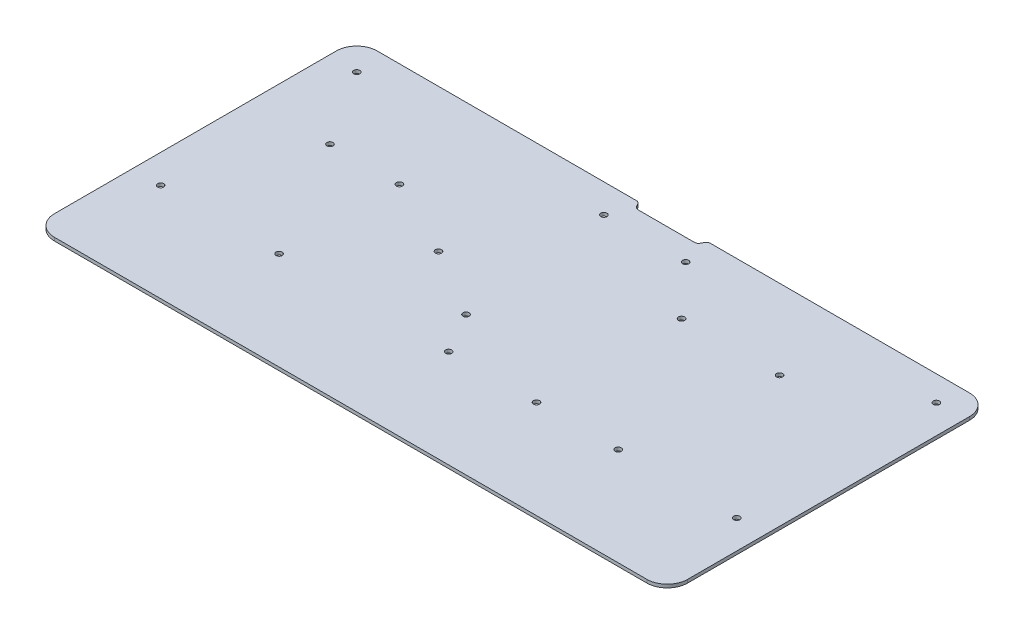
ISO-10303-21;
HEADER;
FILE_DESCRIPTION(('STEP AP214'),'2;1');
FILE_NAME('part.step','',(''),(''),'','','');
FILE_SCHEMA(('AUTOMOTIVE_DESIGN { 1 0 10303 214 1 1 1 1 }'));
ENDSEC;
DATA;
#1=APPLICATION_CONTEXT('core data for automotive mechanical design processes');
#2=APPLICATION_PROTOCOL_DEFINITION('international standard','automotive_design',2000,#1);
#3=PRODUCT_CONTEXT('',#1,'mechanical');
#4=PRODUCT('Part','Part','',(#3));
#5=PRODUCT_RELATED_PRODUCT_CATEGORY('part','',(#4));
#6=PRODUCT_DEFINITION_FORMATION('','',#4);
#7=PRODUCT_DEFINITION_CONTEXT('part definition',#1,'design');
#8=PRODUCT_DEFINITION('design','',#6,#7);
#9=PRODUCT_DEFINITION_SHAPE('','',#8);
#10=(LENGTH_UNIT() NAMED_UNIT(*) SI_UNIT(.MILLI.,.METRE.));
#11=(NAMED_UNIT(*) PLANE_ANGLE_UNIT() SI_UNIT($,.RADIAN.));
#12=(NAMED_UNIT(*) SI_UNIT($,.STERADIAN.) SOLID_ANGLE_UNIT());
#13=UNCERTAINTY_MEASURE_WITH_UNIT(LENGTH_MEASURE(1.E-05),#10,'distance_accuracy_value','');
#14=(GEOMETRIC_REPRESENTATION_CONTEXT(3) GLOBAL_UNCERTAINTY_ASSIGNED_CONTEXT((#13)) GLOBAL_UNIT_ASSIGNED_CONTEXT((#10,
#11,#12)) REPRESENTATION_CONTEXT('',''));
#15=CARTESIAN_POINT('',(0.,0.,0.));
#16=DIRECTION('',(0.,0.,1.));
#17=DIRECTION('',(1.,0.,0.));
#18=AXIS2_PLACEMENT_3D('',#15,#16,#17);
#19=CARTESIAN_POINT('',(10.,1.6,10.));
#20=DIRECTION('',(0.,1.,0.));
#21=DIRECTION('',(0.,0.,1.));
#22=AXIS2_PLACEMENT_3D('',#19,#20,#21);
#23=PLANE('',#22);
#24=CARTESIAN_POINT('',(198.,1.6,110.));
#25=DIRECTION('',(0.,1.,0.));
#26=DIRECTION('',(0.,0.,1.));
#27=AXIS2_PLACEMENT_3D('',#24,#25,#26);
#28=CIRCLE('',#27,1.5);
#29=CARTESIAN_POINT('',(198.,1.6,111.5));
#30=VERTEX_POINT('',#29);
#31=EDGE_CURVE('E444',#30,#30,#28,.T.);
#32=ORIENTED_EDGE('',*,*,#31,.F.);
#33=EDGE_LOOP('',(#32));
#34=FACE_BOUND('',#33,.T.);
#35=CARTESIAN_POINT('',(110.,1.6,69.9999999999988));
#36=DIRECTION('',(0.,1.,0.));
#37=DIRECTION('',(0.,0.,1.));
#38=AXIS2_PLACEMENT_3D('',#35,#36,#37);
#39=CIRCLE('',#38,1.5);
#40=CARTESIAN_POINT('',(110.,1.6,71.4999999999988));
#41=VERTEX_POINT('',#40);
#42=EDGE_CURVE('E460',#41,#41,#39,.T.);
#43=ORIENTED_EDGE('',*,*,#42,.F.);
#44=EDGE_LOOP('',(#43));
#45=FACE_BOUND('',#44,.T.);
#46=CARTESIAN_POINT('',(246.,1.6,39.));
#47=DIRECTION('',(0.,1.,0.));
#48=DIRECTION('',(0.,0.,1.));
#49=AXIS2_PLACEMENT_3D('',#46,#47,#48);
#50=CIRCLE('',#49,1.49999999999997);
#51=CARTESIAN_POINT('',(246.,1.6,40.5));
#52=VERTEX_POINT('',#51);
#53=EDGE_CURVE('E476',#52,#52,#50,.T.);
#54=ORIENTED_EDGE('',*,*,#53,.F.);
#55=EDGE_LOOP('',(#54));
#56=FACE_BOUND('',#55,.T.);
#57=CARTESIAN_POINT('',(72.,1.6,51.0967741935482));
#58=DIRECTION('',(0.,1.,0.));
#59=DIRECTION('',(0.,0.,1.));
#60=AXIS2_PLACEMENT_3D('',#57,#58,#59);
#61=CIRCLE('',#60,1.50000000000001);
#62=CARTESIAN_POINT('',(72.,1.6,52.5967741935482));
#63=VERTEX_POINT('',#62);
#64=EDGE_CURVE('E492',#63,#63,#61,.T.);
#65=ORIENTED_EDGE('',*,*,#64,.F.);
#66=EDGE_LOOP('',(#65));
#67=FACE_BOUND('',#66,.T.);
#68=CARTESIAN_POINT('',(155.,1.6,110.));
#69=DIRECTION('',(0.,1.,0.));
#70=DIRECTION('',(0.,0.,1.));
#71=AXIS2_PLACEMENT_3D('',#68,#69,#70);
#72=CIRCLE('',#71,1.5);
#73=CARTESIAN_POINT('',(155.,1.6,111.5));
#74=VERTEX_POINT('',#73);
#75=EDGE_CURVE('E508',#74,#74,#72,.T.);
#76=ORIENTED_EDGE('',*,*,#75,.F.);
#77=EDGE_LOOP('',(#76));
#78=FACE_BOUND('',#77,.T.);
#79=CARTESIAN_POINT('',(14.,1.6,110.));
#80=DIRECTION('',(0.,1.,0.));
#81=DIRECTION('',(0.,0.,1.));
#82=AXIS2_PLACEMENT_3D('',#79,#80,#81);
#83=CIRCLE('',#82,1.49999999999997);
#84=CARTESIAN_POINT('',(14.,1.6,111.5));
#85=VERTEX_POINT('',#84);
#86=EDGE_CURVE('E524',#85,#85,#83,.T.);
#87=ORIENTED_EDGE('',*,*,#86,.F.);
#88=EDGE_LOOP('',(#87));
#89=FACE_BOUND('',#88,.T.);
#90=CARTESIAN_POINT('',(296.,1.6,12.2856825395512));
#91=DIRECTION('',(0.,1.,0.));
#92=DIRECTION('',(0.,0.,1.));
#93=AXIS2_PLACEMENT_3D('',#90,#91,#92);
#94=CIRCLE('',#93,1.49999999999997);
#95=CARTESIAN_POINT('',(296.,1.6,13.7856825395512));
#96=VERTEX_POINT('',#95);
#97=EDGE_CURVE('E540',#96,#96,#94,.T.);
#98=ORIENTED_EDGE('',*,*,#97,.F.);
#99=EDGE_LOOP('',(#98));
#100=FACE_BOUND('',#99,.T.);
#101=CARTESIAN_POINT('',(296.,1.6,110.));
#102=DIRECTION('',(0.,1.,0.));
#103=DIRECTION('',(0.,0.,1.));
#104=AXIS2_PLACEMENT_3D('',#101,#102,#103);
#105=CIRCLE('',#104,1.49999999999997);
#106=CARTESIAN_POINT('',(296.,1.6,111.5));
#107=VERTEX_POINT('',#106);
#108=EDGE_CURVE('E194',#107,#107,#105,.T.);
#109=ORIENTED_EDGE('',*,*,#108,.F.);
#110=EDGE_LOOP('',(#109));
#111=FACE_BOUND('',#110,.T.);
#112=CARTESIAN_POINT('',(10.,1.6,10.));
#113=DIRECTION('',(0.,1.,0.));
#114=DIRECTION('',(0.,0.,1.));
#115=AXIS2_PLACEMENT_3D('',#112,#113,#114);
#116=CIRCLE('',#115,10.);
#117=CARTESIAN_POINT('',(10.,1.6,0.));
#118=VERTEX_POINT('',#117);
#119=CARTESIAN_POINT('',(0.,1.6,10.));
#120=VERTEX_POINT('',#119);
#121=EDGE_CURVE('E237',#118,#120,#116,.T.);
#122=ORIENTED_EDGE('',*,*,#121,.T.);
#123=DIRECTION('',(0.,0.,1.));
#124=VECTOR('',#123,1.);
#125=CARTESIAN_POINT('',(0.,1.6,148.));
#126=LINE('',#125,#124);
#127=CARTESIAN_POINT('',(0.,1.6,148.));
#128=VERTEX_POINT('',#127);
#129=EDGE_CURVE('E124',#120,#128,#126,.T.);
#130=ORIENTED_EDGE('',*,*,#129,.T.);
#131=CARTESIAN_POINT('',(10.,1.6,148.));
#132=DIRECTION('',(0.,1.,0.));
#133=DIRECTION('',(0.,0.,-1.));
#134=AXIS2_PLACEMENT_3D('',#131,#132,#133);
#135=CIRCLE('',#134,10.);
#136=CARTESIAN_POINT('',(10.0000000000001,1.6,158.));
#137=VERTEX_POINT('',#136);
#138=EDGE_CURVE('E290',#128,#137,#135,.T.);
#139=ORIENTED_EDGE('',*,*,#138,.T.);
#140=DIRECTION('',(1.,0.,0.));
#141=VECTOR('',#140,1.);
#142=CARTESIAN_POINT('',(10.0000000000001,1.6,158.));
#143=LINE('',#142,#141);
#144=CARTESIAN_POINT('',(300.,1.6,158.));
#145=VERTEX_POINT('',#144);
#146=EDGE_CURVE('E310',#137,#145,#143,.T.);
#147=ORIENTED_EDGE('',*,*,#146,.T.);
#148=CARTESIAN_POINT('',(300.,1.6,148.));
#149=DIRECTION('',(0.,1.,0.));
#150=DIRECTION('',(0.,0.,-1.));
#151=AXIS2_PLACEMENT_3D('',#148,#149,#150);
#152=CIRCLE('',#151,10.);
#153=CARTESIAN_POINT('',(310.,1.6,148.));
#154=VERTEX_POINT('',#153);
#155=EDGE_CURVE('E306',#145,#154,#152,.T.);
#156=ORIENTED_EDGE('',*,*,#155,.T.);
#157=DIRECTION('',(0.,0.,-1.));
#158=VECTOR('',#157,1.);
#159=CARTESIAN_POINT('',(310.,1.6,148.));
#160=LINE('',#159,#158);
#161=CARTESIAN_POINT('',(310.,1.6,10.));
#162=VERTEX_POINT('',#161);
#163=EDGE_CURVE('E309',#154,#162,#160,.T.);
#164=ORIENTED_EDGE('',*,*,#163,.T.);
#165=CARTESIAN_POINT('',(300.,1.6,10.));
#166=DIRECTION('',(0.,1.,0.));
#167=DIRECTION('',(0.,0.,-1.));
#168=AXIS2_PLACEMENT_3D('',#165,#166,#167);
#169=CIRCLE('',#168,9.99999999999998);
#170=CARTESIAN_POINT('',(300.,1.6,0.));
#171=VERTEX_POINT('',#170);
#172=EDGE_CURVE('E314',#162,#171,#169,.T.);
#173=ORIENTED_EDGE('',*,*,#172,.T.);
#174=DIRECTION('',(-1.,0.,0.));
#175=VECTOR('',#174,1.);
#176=CARTESIAN_POINT('',(173.115639288473,1.6,0.));
#177=LINE('',#176,#175);
#178=CARTESIAN_POINT('',(173.115639288473,1.6,0.));
#179=VERTEX_POINT('',#178);
#180=EDGE_CURVE('E321',#171,#179,#177,.T.);
#181=ORIENTED_EDGE('',*,*,#180,.T.);
#182=CARTESIAN_POINT('',(173.115639288473,1.6,2.));
#183=DIRECTION('',(0.,1.,0.));
#184=DIRECTION('',(0.,0.,1.));
#185=AXIS2_PLACEMENT_3D('',#182,#183,#184);
#186=CIRCLE('',#185,2.00000000000002);
#187=CARTESIAN_POINT('',(171.365639288473,1.6,1.03175416344812));
#188=VERTEX_POINT('',#187);
#189=EDGE_CURVE('E324',#179,#188,#186,.T.);
#190=ORIENTED_EDGE('',*,*,#189,.T.);
#191=DIRECTION('',(-0.484122918275934,0.,0.874999999999996));
#192=VECTOR('',#191,1.);
#193=CARTESIAN_POINT('',(170.570852384631,1.6,2.46824583655185));
#194=LINE('',#193,#192);
#195=CARTESIAN_POINT('',(170.570852384631,1.6,2.46824583655186));
#196=VERTEX_POINT('',#195);
#197=EDGE_CURVE('E327',#188,#196,#194,.T.);
#198=ORIENTED_EDGE('',*,*,#197,.T.);
#199=CARTESIAN_POINT('',(168.820852384631,1.6,1.5));
#200=DIRECTION('',(0.,-1.,0.));
#201=DIRECTION('',(0.,0.,-1.));
#202=AXIS2_PLACEMENT_3D('',#199,#200,#201);
#203=CIRCLE('',#202,1.99999999999997);
#204=CARTESIAN_POINT('',(168.820852384631,1.6,3.5));
#205=VERTEX_POINT('',#204);
#206=EDGE_CURVE('E330',#196,#205,#203,.T.);
#207=ORIENTED_EDGE('',*,*,#206,.T.);
#208=DIRECTION('',(-1.,0.,0.));
#209=VECTOR('',#208,1.);
#210=CARTESIAN_POINT('',(166.5,1.6,3.5));
#211=LINE('',#210,#209);
#212=CARTESIAN_POINT('',(141.179147615369,1.6,3.5));
#213=VERTEX_POINT('',#212);
#214=EDGE_CURVE('E333',#205,#213,#211,.T.);
#215=ORIENTED_EDGE('',*,*,#214,.T.);
#216=CARTESIAN_POINT('',(141.179147615369,1.6,1.5));
#217=DIRECTION('',(0.,-1.,0.));
#218=DIRECTION('',(0.,0.,-1.));
#219=AXIS2_PLACEMENT_3D('',#216,#217,#218);
#220=CIRCLE('',#219,2.);
#221=CARTESIAN_POINT('',(139.429147615369,1.6,2.46824583655185));
#222=VERTEX_POINT('',#221);
#223=EDGE_CURVE('E167',#213,#222,#220,.T.);
#224=ORIENTED_EDGE('',*,*,#223,.T.);
#225=DIRECTION('',(-0.484122918275929,0.,-0.874999999999999));
#226=VECTOR('',#225,1.);
#227=CARTESIAN_POINT('',(139.429147615369,1.6,2.46824583655185));
#228=LINE('',#227,#226);
#229=CARTESIAN_POINT('',(138.634360711527,1.6,1.03175416344815));
#230=VERTEX_POINT('',#229);
#231=EDGE_CURVE('E161',#222,#230,#228,.T.);
#232=ORIENTED_EDGE('',*,*,#231,.T.);
#233=CARTESIAN_POINT('',(136.884360711527,1.6,2.));
#234=DIRECTION('',(0.,1.,0.));
#235=DIRECTION('',(0.,0.,-1.));
#236=AXIS2_PLACEMENT_3D('',#233,#234,#235);
#237=CIRCLE('',#236,2.);
#238=CARTESIAN_POINT('',(136.884360711527,1.6,0.));
#239=VERTEX_POINT('',#238);
#240=EDGE_CURVE('E165',#230,#239,#237,.T.);
#241=ORIENTED_EDGE('',*,*,#240,.T.);
#242=DIRECTION('',(-1.,0.,0.));
#243=VECTOR('',#242,1.);
#244=CARTESIAN_POINT('',(10.,1.6,0.));
#245=LINE('',#244,#243);
#246=EDGE_CURVE('E57',#239,#118,#245,.T.);
#247=ORIENTED_EDGE('',*,*,#246,.T.);
#248=EDGE_LOOP('',(#122,#130,#139,#147,#156,#164,#173,#181,#190,#198,#207,#215,#224,#232,#241,#247));
#249=FACE_BOUND('',#248,.T.);
#250=CARTESIAN_POINT('',(14.,1.6,14.));
#251=DIRECTION('',(0.,1.,0.));
#252=DIRECTION('',(0.,0.,1.));
#253=AXIS2_PLACEMENT_3D('',#250,#251,#252);
#254=CIRCLE('',#253,1.5);
#255=CARTESIAN_POINT('',(14.,1.6,15.5));
#256=VERTEX_POINT('',#255);
#257=EDGE_CURVE('E548',#256,#256,#254,.T.);
#258=ORIENTED_EDGE('',*,*,#257,.F.);
#259=EDGE_LOOP('',(#258));
#260=FACE_BOUND('',#259,.T.);
#261=CARTESIAN_POINT('',(175.,1.6,14.));
#262=DIRECTION('',(0.,1.,0.));
#263=DIRECTION('',(0.,0.,1.));
#264=AXIS2_PLACEMENT_3D('',#261,#262,#263);
#265=CIRCLE('',#264,1.49999999999997);
#266=CARTESIAN_POINT('',(175.,1.6,15.5));
#267=VERTEX_POINT('',#266);
#268=EDGE_CURVE('E532',#267,#267,#265,.T.);
#269=ORIENTED_EDGE('',*,*,#268,.F.);
#270=EDGE_LOOP('',(#269));
#271=FACE_BOUND('',#270,.T.);
#272=CARTESIAN_POINT('',(135.,1.6,14.));
#273=DIRECTION('',(0.,1.,0.));
#274=DIRECTION('',(0.,0.,1.));
#275=AXIS2_PLACEMENT_3D('',#272,#273,#274);
#276=CIRCLE('',#275,1.49999999999997);
#277=CARTESIAN_POINT('',(135.,1.6,15.5));
#278=VERTEX_POINT('',#277);
#279=EDGE_CURVE('E516',#278,#278,#276,.T.);
#280=ORIENTED_EDGE('',*,*,#279,.F.);
#281=EDGE_LOOP('',(#280));
#282=FACE_BOUND('',#281,.T.);
#283=CARTESIAN_POINT('',(72.,1.6,110.));
#284=DIRECTION('',(0.,1.,0.));
#285=DIRECTION('',(0.,0.,1.));
#286=AXIS2_PLACEMENT_3D('',#283,#284,#285);
#287=CIRCLE('',#286,1.5);
#288=CARTESIAN_POINT('',(72.,1.6,111.5));
#289=VERTEX_POINT('',#288);
#290=EDGE_CURVE('E500',#289,#289,#287,.T.);
#291=ORIENTED_EDGE('',*,*,#290,.F.);
#292=EDGE_LOOP('',(#291));
#293=FACE_BOUND('',#292,.T.);
#294=CARTESIAN_POINT('',(238.,1.6,110.));
#295=DIRECTION('',(0.,1.,0.));
#296=DIRECTION('',(0.,0.,1.));
#297=AXIS2_PLACEMENT_3D('',#294,#295,#296);
#298=CIRCLE('',#297,1.49999999999997);
#299=CARTESIAN_POINT('',(238.,1.6,111.5));
#300=VERTEX_POINT('',#299);
#301=EDGE_CURVE('E484',#300,#300,#298,.T.);
#302=ORIENTED_EDGE('',*,*,#301,.F.);
#303=EDGE_LOOP('',(#302));
#304=FACE_BOUND('',#303,.T.);
#305=CARTESIAN_POINT('',(198.,1.6,39.));
#306=DIRECTION('',(0.,1.,0.));
#307=DIRECTION('',(0.,0.,1.));
#308=AXIS2_PLACEMENT_3D('',#305,#306,#307);
#309=CIRCLE('',#308,1.5);
#310=CARTESIAN_POINT('',(198.,1.6,40.5));
#311=VERTEX_POINT('',#310);
#312=EDGE_CURVE('E468',#311,#311,#309,.T.);
#313=ORIENTED_EDGE('',*,*,#312,.F.);
#314=EDGE_LOOP('',(#313));
#315=FACE_BOUND('',#314,.T.);
#316=CARTESIAN_POINT('',(38.,1.6,51.0967741935482));
#317=DIRECTION('',(0.,1.,0.));
#318=DIRECTION('',(0.,0.,1.));
#319=AXIS2_PLACEMENT_3D('',#316,#317,#318);
#320=CIRCLE('',#319,1.5);
#321=CARTESIAN_POINT('',(38.,1.6,52.5967741935482));
#322=VERTEX_POINT('',#321);
#323=EDGE_CURVE('E452',#322,#322,#320,.T.);
#324=ORIENTED_EDGE('',*,*,#323,.F.);
#325=EDGE_LOOP('',(#324));
#326=FACE_BOUND('',#325,.T.);
#327=CARTESIAN_POINT('',(143.5,1.6,89.9999999999986));
#328=DIRECTION('',(0.,1.,0.));
#329=DIRECTION('',(0.,0.,1.));
#330=AXIS2_PLACEMENT_3D('',#327,#328,#329);
#331=CIRCLE('',#330,1.5);
#332=CARTESIAN_POINT('',(143.5,1.6,91.4999999999986));
#333=VERTEX_POINT('',#332);
#334=EDGE_CURVE('E433',#333,#333,#331,.T.);
#335=ORIENTED_EDGE('',*,*,#334,.F.);
#336=EDGE_LOOP('',(#335));
#337=FACE_BOUND('',#336,.T.);
#338=ADVANCED_FACE('F39',(#34,#45,#56,#67,#78,#89,#100,#111,#249,#260,#271,#282,#293,#304,#315,
#326,#337),#23,.T.);
#339=CARTESIAN_POINT('',(10.,0.,10.));
#340=DIRECTION('',(0.,1.,0.));
#341=DIRECTION('',(0.,0.,1.));
#342=AXIS2_PLACEMENT_3D('',#339,#340,#341);
#343=PLANE('',#342);
#344=CARTESIAN_POINT('',(10.,0.,10.));
#345=DIRECTION('',(0.,1.,0.));
#346=DIRECTION('',(0.,0.,1.));
#347=AXIS2_PLACEMENT_3D('',#344,#345,#346);
#348=CIRCLE('',#347,10.);
#349=CARTESIAN_POINT('',(10.,0.,0.));
#350=VERTEX_POINT('',#349);
#351=CARTESIAN_POINT('',(0.,0.,10.));
#352=VERTEX_POINT('',#351);
#353=EDGE_CURVE('E189',#350,#352,#348,.T.);
#354=ORIENTED_EDGE('',*,*,#353,.F.);
#355=DIRECTION('',(-1.,0.,0.));
#356=VECTOR('',#355,1.);
#357=CARTESIAN_POINT('',(10.,0.,0.));
#358=LINE('',#357,#356);
#359=CARTESIAN_POINT('',(136.884360711527,0.,0.));
#360=VERTEX_POINT('',#359);
#361=EDGE_CURVE('E116',#360,#350,#358,.T.);
#362=ORIENTED_EDGE('',*,*,#361,.F.);
#363=CARTESIAN_POINT('',(136.884360711527,0.,2.));
#364=DIRECTION('',(0.,1.,0.));
#365=DIRECTION('',(0.,0.,-1.));
#366=AXIS2_PLACEMENT_3D('',#363,#364,#365);
#367=CIRCLE('',#366,2.);
#368=CARTESIAN_POINT('',(138.634360711527,0.,1.03175416344815));
#369=VERTEX_POINT('',#368);
#370=EDGE_CURVE('E110',#369,#360,#367,.T.);
#371=ORIENTED_EDGE('',*,*,#370,.F.);
#372=DIRECTION('',(-0.484122918275929,0.,-0.874999999999999));
#373=VECTOR('',#372,1.);
#374=CARTESIAN_POINT('',(139.429147615369,0.,2.46824583655185));
#375=LINE('',#374,#373);
#376=CARTESIAN_POINT('',(139.429147615369,0.,2.46824583655185));
#377=VERTEX_POINT('',#376);
#378=EDGE_CURVE('E176',#377,#369,#375,.T.);
#379=ORIENTED_EDGE('',*,*,#378,.F.);
#380=CARTESIAN_POINT('',(141.179147615369,0.,1.5));
#381=DIRECTION('',(0.,-1.,0.));
#382=DIRECTION('',(0.,0.,-1.));
#383=AXIS2_PLACEMENT_3D('',#380,#381,#382);
#384=CIRCLE('',#383,2.);
#385=CARTESIAN_POINT('',(141.179147615369,0.,3.5));
#386=VERTEX_POINT('',#385);
#387=EDGE_CURVE('E228',#386,#377,#384,.T.);
#388=ORIENTED_EDGE('',*,*,#387,.F.);
#389=DIRECTION('',(-1.,0.,0.));
#390=VECTOR('',#389,1.);
#391=CARTESIAN_POINT('',(141.179147615369,0.,3.5));
#392=LINE('',#391,#390);
#393=CARTESIAN_POINT('',(168.820852384631,0.,3.5));
#394=VERTEX_POINT('',#393);
#395=EDGE_CURVE('E225',#394,#386,#392,.T.);
#396=ORIENTED_EDGE('',*,*,#395,.F.);
#397=CARTESIAN_POINT('',(168.820852384631,0.,1.5));
#398=DIRECTION('',(0.,-1.,0.));
#399=DIRECTION('',(0.,0.,-1.));
#400=AXIS2_PLACEMENT_3D('',#397,#398,#399);
#401=CIRCLE('',#400,1.99999999999997);
#402=CARTESIAN_POINT('',(170.570852384631,0.,2.46824583655186));
#403=VERTEX_POINT('',#402);
#404=EDGE_CURVE('E221',#403,#394,#401,.T.);
#405=ORIENTED_EDGE('',*,*,#404,.F.);
#406=DIRECTION('',(-0.484122918275934,0.,0.874999999999996));
#407=VECTOR('',#406,1.);
#408=CARTESIAN_POINT('',(170.570852384631,0.,2.46824583655185));
#409=LINE('',#408,#407);
#410=CARTESIAN_POINT('',(171.365639288473,0.,1.03175416344812));
#411=VERTEX_POINT('',#410);
#412=EDGE_CURVE('E218',#411,#403,#409,.T.);
#413=ORIENTED_EDGE('',*,*,#412,.F.);
#414=CARTESIAN_POINT('',(173.115639288473,0.,2.));
#415=DIRECTION('',(0.,1.,0.));
#416=DIRECTION('',(0.,0.,1.));
#417=AXIS2_PLACEMENT_3D('',#414,#415,#416);
#418=CIRCLE('',#417,2.00000000000002);
#419=CARTESIAN_POINT('',(173.115639288473,0.,0.));
#420=VERTEX_POINT('',#419);
#421=EDGE_CURVE('E215',#420,#411,#418,.T.);
#422=ORIENTED_EDGE('',*,*,#421,.F.);
#423=DIRECTION('',(-1.,0.,0.));
#424=VECTOR('',#423,1.);
#425=CARTESIAN_POINT('',(173.115639288473,0.,0.));
#426=LINE('',#425,#424);
#427=CARTESIAN_POINT('',(300.,0.,0.));
#428=VERTEX_POINT('',#427);
#429=EDGE_CURVE('E212',#428,#420,#426,.T.);
#430=ORIENTED_EDGE('',*,*,#429,.F.);
#431=CARTESIAN_POINT('',(300.,0.,10.));
#432=DIRECTION('',(0.,1.,0.));
#433=DIRECTION('',(0.,0.,-1.));
#434=AXIS2_PLACEMENT_3D('',#431,#432,#433);
#435=CIRCLE('',#434,9.99999999999998);
#436=CARTESIAN_POINT('',(310.,0.,10.));
#437=VERTEX_POINT('',#436);
#438=EDGE_CURVE('E209',#437,#428,#435,.T.);
#439=ORIENTED_EDGE('',*,*,#438,.F.);
#440=DIRECTION('',(0.,0.,-1.));
#441=VECTOR('',#440,1.);
#442=CARTESIAN_POINT('',(310.,0.,148.));
#443=LINE('',#442,#441);
#444=CARTESIAN_POINT('',(310.,0.,148.));
#445=VERTEX_POINT('',#444);
#446=EDGE_CURVE('E206',#445,#437,#443,.T.);
#447=ORIENTED_EDGE('',*,*,#446,.F.);
#448=CARTESIAN_POINT('',(300.,0.,148.));
#449=DIRECTION('',(0.,1.,0.));
#450=DIRECTION('',(0.,0.,-1.));
#451=AXIS2_PLACEMENT_3D('',#448,#449,#450);
#452=CIRCLE('',#451,10.);
#453=CARTESIAN_POINT('',(300.,0.,158.));
#454=VERTEX_POINT('',#453);
#455=EDGE_CURVE('E203',#454,#445,#452,.T.);
#456=ORIENTED_EDGE('',*,*,#455,.F.);
#457=DIRECTION('',(1.,0.,0.));
#458=VECTOR('',#457,1.);
#459=CARTESIAN_POINT('',(10.0000000000001,0.,158.));
#460=LINE('',#459,#458);
#461=CARTESIAN_POINT('',(10.0000000000001,0.,158.));
#462=VERTEX_POINT('',#461);
#463=EDGE_CURVE('E200',#462,#454,#460,.T.);
#464=ORIENTED_EDGE('',*,*,#463,.F.);
#465=CARTESIAN_POINT('',(10.,0.,148.));
#466=DIRECTION('',(0.,1.,0.));
#467=DIRECTION('',(0.,0.,-1.));
#468=AXIS2_PLACEMENT_3D('',#465,#466,#467);
#469=CIRCLE('',#468,10.);
#470=CARTESIAN_POINT('',(0.,0.,148.));
#471=VERTEX_POINT('',#470);
#472=EDGE_CURVE('E197',#471,#462,#469,.T.);
#473=ORIENTED_EDGE('',*,*,#472,.F.);
#474=DIRECTION('',(0.,0.,1.));
#475=VECTOR('',#474,1.);
#476=CARTESIAN_POINT('',(0.,0.,148.));
#477=LINE('',#476,#475);
#478=EDGE_CURVE('E193',#352,#471,#477,.T.);
#479=ORIENTED_EDGE('',*,*,#478,.F.);
#480=EDGE_LOOP('',(#354,#362,#371,#379,#388,#396,#405,#413,#422,#430,#439,#447,#456,#464,#473,#479));
#481=FACE_BOUND('',#480,.T.);
#482=CARTESIAN_POINT('',(296.,0.,110.));
#483=DIRECTION('',(0.,1.,0.));
#484=DIRECTION('',(0.,0.,1.));
#485=AXIS2_PLACEMENT_3D('',#482,#483,#484);
#486=CIRCLE('',#485,1.49999999999997);
#487=CARTESIAN_POINT('',(296.,0.,111.5));
#488=VERTEX_POINT('',#487);
#489=EDGE_CURVE('E552',#488,#488,#486,.T.);
#490=ORIENTED_EDGE('',*,*,#489,.T.);
#491=EDGE_LOOP('',(#490));
#492=FACE_BOUND('',#491,.T.);
#493=CARTESIAN_POINT('',(14.,0.,14.));
#494=DIRECTION('',(0.,1.,0.));
#495=DIRECTION('',(0.,0.,1.));
#496=AXIS2_PLACEMENT_3D('',#493,#494,#495);
#497=CIRCLE('',#496,1.5);
#498=CARTESIAN_POINT('',(14.,0.,15.5));
#499=VERTEX_POINT('',#498);
#500=EDGE_CURVE('E544',#499,#499,#497,.T.);
#501=ORIENTED_EDGE('',*,*,#500,.T.);
#502=EDGE_LOOP('',(#501));
#503=FACE_BOUND('',#502,.T.);
#504=CARTESIAN_POINT('',(296.,0.,12.2856825395512));
#505=DIRECTION('',(0.,1.,0.));
#506=DIRECTION('',(0.,0.,1.));
#507=AXIS2_PLACEMENT_3D('',#504,#505,#506);
#508=CIRCLE('',#507,1.49999999999997);
#509=CARTESIAN_POINT('',(296.,0.,13.7856825395512));
#510=VERTEX_POINT('',#509);
#511=EDGE_CURVE('E536',#510,#510,#508,.T.);
#512=ORIENTED_EDGE('',*,*,#511,.T.);
#513=EDGE_LOOP('',(#512));
#514=FACE_BOUND('',#513,.T.);
#515=CARTESIAN_POINT('',(175.,0.,14.));
#516=DIRECTION('',(0.,1.,0.));
#517=DIRECTION('',(0.,0.,1.));
#518=AXIS2_PLACEMENT_3D('',#515,#516,#517);
#519=CIRCLE('',#518,1.49999999999997);
#520=CARTESIAN_POINT('',(175.,0.,15.5));
#521=VERTEX_POINT('',#520);
#522=EDGE_CURVE('E528',#521,#521,#519,.T.);
#523=ORIENTED_EDGE('',*,*,#522,.T.);
#524=EDGE_LOOP('',(#523));
#525=FACE_BOUND('',#524,.T.);
#526=CARTESIAN_POINT('',(14.,0.,110.));
#527=DIRECTION('',(0.,1.,0.));
#528=DIRECTION('',(0.,0.,1.));
#529=AXIS2_PLACEMENT_3D('',#526,#527,#528);
#530=CIRCLE('',#529,1.49999999999997);
#531=CARTESIAN_POINT('',(14.,0.,111.5));
#532=VERTEX_POINT('',#531);
#533=EDGE_CURVE('E520',#532,#532,#530,.T.);
#534=ORIENTED_EDGE('',*,*,#533,.T.);
#535=EDGE_LOOP('',(#534));
#536=FACE_BOUND('',#535,.T.);
#537=CARTESIAN_POINT('',(135.,0.,14.));
#538=DIRECTION('',(0.,1.,0.));
#539=DIRECTION('',(0.,0.,1.));
#540=AXIS2_PLACEMENT_3D('',#537,#538,#539);
#541=CIRCLE('',#540,1.49999999999997);
#542=CARTESIAN_POINT('',(135.,0.,15.5));
#543=VERTEX_POINT('',#542);
#544=EDGE_CURVE('E512',#543,#543,#541,.T.);
#545=ORIENTED_EDGE('',*,*,#544,.T.);
#546=EDGE_LOOP('',(#545));
#547=FACE_BOUND('',#546,.T.);
#548=CARTESIAN_POINT('',(155.,0.,110.));
#549=DIRECTION('',(0.,1.,0.));
#550=DIRECTION('',(0.,0.,1.));
#551=AXIS2_PLACEMENT_3D('',#548,#549,#550);
#552=CIRCLE('',#551,1.5);
#553=CARTESIAN_POINT('',(155.,0.,111.5));
#554=VERTEX_POINT('',#553);
#555=EDGE_CURVE('E504',#554,#554,#552,.T.);
#556=ORIENTED_EDGE('',*,*,#555,.T.);
#557=EDGE_LOOP('',(#556));
#558=FACE_BOUND('',#557,.T.);
#559=CARTESIAN_POINT('',(72.,0.,110.));
#560=DIRECTION('',(0.,1.,0.));
#561=DIRECTION('',(0.,0.,1.));
#562=AXIS2_PLACEMENT_3D('',#559,#560,#561);
#563=CIRCLE('',#562,1.5);
#564=CARTESIAN_POINT('',(72.,0.,111.5));
#565=VERTEX_POINT('',#564);
#566=EDGE_CURVE('E496',#565,#565,#563,.T.);
#567=ORIENTED_EDGE('',*,*,#566,.T.);
#568=EDGE_LOOP('',(#567));
#569=FACE_BOUND('',#568,.T.);
#570=CARTESIAN_POINT('',(72.,0.,51.0967741935482));
#571=DIRECTION('',(0.,1.,0.));
#572=DIRECTION('',(0.,0.,1.));
#573=AXIS2_PLACEMENT_3D('',#570,#571,#572);
#574=CIRCLE('',#573,1.50000000000001);
#575=CARTESIAN_POINT('',(72.,0.,52.5967741935482));
#576=VERTEX_POINT('',#575);
#577=EDGE_CURVE('E488',#576,#576,#574,.T.);
#578=ORIENTED_EDGE('',*,*,#577,.T.);
#579=EDGE_LOOP('',(#578));
#580=FACE_BOUND('',#579,.T.);
#581=CARTESIAN_POINT('',(238.,0.,110.));
#582=DIRECTION('',(0.,1.,0.));
#583=DIRECTION('',(0.,0.,1.));
#584=AXIS2_PLACEMENT_3D('',#581,#582,#583);
#585=CIRCLE('',#584,1.49999999999997);
#586=CARTESIAN_POINT('',(238.,0.,111.5));
#587=VERTEX_POINT('',#586);
#588=EDGE_CURVE('E480',#587,#587,#585,.T.);
#589=ORIENTED_EDGE('',*,*,#588,.T.);
#590=EDGE_LOOP('',(#589));
#591=FACE_BOUND('',#590,.T.);
#592=CARTESIAN_POINT('',(246.,0.,39.));
#593=DIRECTION('',(0.,1.,0.));
#594=DIRECTION('',(0.,0.,1.));
#595=AXIS2_PLACEMENT_3D('',#592,#593,#594);
#596=CIRCLE('',#595,1.49999999999997);
#597=CARTESIAN_POINT('',(246.,0.,40.5));
#598=VERTEX_POINT('',#597);
#599=EDGE_CURVE('E472',#598,#598,#596,.T.);
#600=ORIENTED_EDGE('',*,*,#599,.T.);
#601=EDGE_LOOP('',(#600));
#602=FACE_BOUND('',#601,.T.);
#603=CARTESIAN_POINT('',(198.,0.,39.));
#604=DIRECTION('',(0.,1.,0.));
#605=DIRECTION('',(0.,0.,1.));
#606=AXIS2_PLACEMENT_3D('',#603,#604,#605);
#607=CIRCLE('',#606,1.5);
#608=CARTESIAN_POINT('',(198.,0.,40.5));
#609=VERTEX_POINT('',#608);
#610=EDGE_CURVE('E464',#609,#609,#607,.T.);
#611=ORIENTED_EDGE('',*,*,#610,.T.);
#612=EDGE_LOOP('',(#611));
#613=FACE_BOUND('',#612,.T.);
#614=CARTESIAN_POINT('',(110.,0.,69.9999999999988));
#615=DIRECTION('',(0.,1.,0.));
#616=DIRECTION('',(0.,0.,1.));
#617=AXIS2_PLACEMENT_3D('',#614,#615,#616);
#618=CIRCLE('',#617,1.5);
#619=CARTESIAN_POINT('',(110.,0.,71.4999999999988));
#620=VERTEX_POINT('',#619);
#621=EDGE_CURVE('E456',#620,#620,#618,.T.);
#622=ORIENTED_EDGE('',*,*,#621,.T.);
#623=EDGE_LOOP('',(#622));
#624=FACE_BOUND('',#623,.T.);
#625=CARTESIAN_POINT('',(38.,0.,51.0967741935482));
#626=DIRECTION('',(0.,1.,0.));
#627=DIRECTION('',(0.,0.,1.));
#628=AXIS2_PLACEMENT_3D('',#625,#626,#627);
#629=CIRCLE('',#628,1.5);
#630=CARTESIAN_POINT('',(38.,0.,52.5967741935482));
#631=VERTEX_POINT('',#630);
#632=EDGE_CURVE('E448',#631,#631,#629,.T.);
#633=ORIENTED_EDGE('',*,*,#632,.T.);
#634=EDGE_LOOP('',(#633));
#635=FACE_BOUND('',#634,.T.);
#636=CARTESIAN_POINT('',(198.,0.,110.));
#637=DIRECTION('',(0.,1.,0.));
#638=DIRECTION('',(0.,0.,1.));
#639=AXIS2_PLACEMENT_3D('',#636,#637,#638);
#640=CIRCLE('',#639,1.5);
#641=CARTESIAN_POINT('',(198.,0.,111.5));
#642=VERTEX_POINT('',#641);
#643=EDGE_CURVE('E441',#642,#642,#640,.T.);
#644=ORIENTED_EDGE('',*,*,#643,.T.);
#645=EDGE_LOOP('',(#644));
#646=FACE_BOUND('',#645,.T.);
#647=CARTESIAN_POINT('',(143.5,0.,89.9999999999986));
#648=DIRECTION('',(0.,1.,0.));
#649=DIRECTION('',(0.,0.,1.));
#650=AXIS2_PLACEMENT_3D('',#647,#648,#649);
#651=CIRCLE('',#650,1.5);
#652=CARTESIAN_POINT('',(143.5,0.,91.4999999999986));
#653=VERTEX_POINT('',#652);
#654=EDGE_CURVE('E436',#653,#653,#651,.T.);
#655=ORIENTED_EDGE('',*,*,#654,.T.);
#656=EDGE_LOOP('',(#655));
#657=FACE_BOUND('',#656,.T.);
#658=ADVANCED_FACE('F294',(#481,#492,#503,#514,#525,#536,#547,#558,#569,#580,#591,#602,#613,
#624,#635,#646,#657),#343,.F.);
#659=CARTESIAN_POINT('',(10.,1.6,10.));
#660=DIRECTION('',(0.,-1.,0.));
#661=DIRECTION('',(0.,0.,-1.));
#662=AXIS2_PLACEMENT_3D('',#659,#660,#661);
#663=CYLINDRICAL_SURFACE('',#662,10.);
#664=ORIENTED_EDGE('',*,*,#353,.T.);
#665=DIRECTION('',(0.,-1.,0.));
#666=VECTOR('',#665,1.);
#667=CARTESIAN_POINT('',(0.,1.6,10.));
#668=LINE('',#667,#666);
#669=EDGE_CURVE('E11',#120,#352,#668,.T.);
#670=ORIENTED_EDGE('',*,*,#669,.F.);
#671=ORIENTED_EDGE('',*,*,#121,.F.);
#672=DIRECTION('',(0.,-1.,0.));
#673=VECTOR('',#672,1.);
#674=CARTESIAN_POINT('',(10.,1.6,0.));
#675=LINE('',#674,#673);
#676=EDGE_CURVE('E185',#118,#350,#675,.T.);
#677=ORIENTED_EDGE('',*,*,#676,.T.);
#678=EDGE_LOOP('',(#664,#670,#671,#677));
#679=FACE_BOUND('',#678,.T.);
#680=ADVANCED_FACE('F41',(#679),#663,.T.);
#681=CARTESIAN_POINT('',(0.,1.6,148.));
#682=DIRECTION('',(1.,0.,0.));
#683=DIRECTION('',(0.,0.,-1.));
#684=AXIS2_PLACEMENT_3D('',#681,#682,#683);
#685=PLANE('',#684);
#686=ORIENTED_EDGE('',*,*,#478,.T.);
#687=DIRECTION('',(0.,-1.,0.));
#688=VECTOR('',#687,1.);
#689=CARTESIAN_POINT('',(0.,1.6,148.));
#690=LINE('',#689,#688);
#691=EDGE_CURVE('E49',#128,#471,#690,.T.);
#692=ORIENTED_EDGE('',*,*,#691,.F.);
#693=ORIENTED_EDGE('',*,*,#129,.F.);
#694=ORIENTED_EDGE('',*,*,#669,.T.);
#695=EDGE_LOOP('',(#686,#692,#693,#694));
#696=FACE_BOUND('',#695,.T.);
#697=ADVANCED_FACE('F818',(#696),#685,.F.);
#698=CARTESIAN_POINT('',(10.,1.6,148.));
#699=DIRECTION('',(0.,-1.,0.));
#700=DIRECTION('',(0.,0.,-1.));
#701=AXIS2_PLACEMENT_3D('',#698,#699,#700);
#702=CYLINDRICAL_SURFACE('',#701,10.);
#703=ORIENTED_EDGE('',*,*,#472,.T.);
#704=DIRECTION('',(0.,-1.,0.));
#705=VECTOR('',#704,1.);
#706=CARTESIAN_POINT('',(10.0000000000001,1.6,158.));
#707=LINE('',#706,#705);
#708=EDGE_CURVE('E280',#137,#462,#707,.T.);
#709=ORIENTED_EDGE('',*,*,#708,.F.);
#710=ORIENTED_EDGE('',*,*,#138,.F.);
#711=ORIENTED_EDGE('',*,*,#691,.T.);
#712=EDGE_LOOP('',(#703,#709,#710,#711));
#713=FACE_BOUND('',#712,.T.);
#714=ADVANCED_FACE('F288',(#713),#702,.T.);
#715=CARTESIAN_POINT('',(10.0000000000001,1.6,158.));
#716=DIRECTION('',(0.,0.,-1.));
#717=DIRECTION('',(-1.,0.,0.));
#718=AXIS2_PLACEMENT_3D('',#715,#716,#717);
#719=PLANE('',#718);
#720=ORIENTED_EDGE('',*,*,#463,.T.);
#721=DIRECTION('',(0.,-1.,0.));
#722=VECTOR('',#721,1.);
#723=CARTESIAN_POINT('',(300.,1.6,158.));
#724=LINE('',#723,#722);
#725=EDGE_CURVE('E276',#145,#454,#724,.T.);
#726=ORIENTED_EDGE('',*,*,#725,.F.);
#727=ORIENTED_EDGE('',*,*,#146,.F.);
#728=ORIENTED_EDGE('',*,*,#708,.T.);
#729=EDGE_LOOP('',(#720,#726,#727,#728));
#730=FACE_BOUND('',#729,.T.);
#731=ADVANCED_FACE('F300',(#730),#719,.F.);
#732=CARTESIAN_POINT('',(300.,1.6,148.));
#733=DIRECTION('',(0.,-1.,0.));
#734=DIRECTION('',(0.,0.,-1.));
#735=AXIS2_PLACEMENT_3D('',#732,#733,#734);
#736=CYLINDRICAL_SURFACE('',#735,10.);
#737=ORIENTED_EDGE('',*,*,#455,.T.);
#738=DIRECTION('',(0.,-1.,0.));
#739=VECTOR('',#738,1.);
#740=CARTESIAN_POINT('',(310.,1.6,148.));
#741=LINE('',#740,#739);
#742=EDGE_CURVE('E272',#154,#445,#741,.T.);
#743=ORIENTED_EDGE('',*,*,#742,.F.);
#744=ORIENTED_EDGE('',*,*,#155,.F.);
#745=ORIENTED_EDGE('',*,*,#725,.T.);
#746=EDGE_LOOP('',(#737,#743,#744,#745));
#747=FACE_BOUND('',#746,.T.);
#748=ADVANCED_FACE('F304',(#747),#736,.T.);
#749=CARTESIAN_POINT('',(310.,1.6,148.));
#750=DIRECTION('',(-1.,0.,0.));
#751=DIRECTION('',(0.,0.,1.));
#752=AXIS2_PLACEMENT_3D('',#749,#750,#751);
#753=PLANE('',#752);
#754=ORIENTED_EDGE('',*,*,#446,.T.);
#755=DIRECTION('',(0.,-1.,0.));
#756=VECTOR('',#755,1.);
#757=CARTESIAN_POINT('',(310.,1.6,10.));
#758=LINE('',#757,#756);
#759=EDGE_CURVE('E268',#162,#437,#758,.T.);
#760=ORIENTED_EDGE('',*,*,#759,.F.);
#761=ORIENTED_EDGE('',*,*,#163,.F.);
#762=ORIENTED_EDGE('',*,*,#742,.T.);
#763=EDGE_LOOP('',(#754,#760,#761,#762));
#764=FACE_BOUND('',#763,.T.);
#765=ADVANCED_FACE('F783',(#764),#753,.F.);
#766=CARTESIAN_POINT('',(300.,1.6,10.));
#767=DIRECTION('',(0.,-1.,0.));
#768=DIRECTION('',(0.,0.,-1.));
#769=AXIS2_PLACEMENT_3D('',#766,#767,#768);
#770=CYLINDRICAL_SURFACE('',#769,9.99999999999998);
#771=ORIENTED_EDGE('',*,*,#438,.T.);
#772=DIRECTION('',(0.,-1.,0.));
#773=VECTOR('',#772,1.);
#774=CARTESIAN_POINT('',(300.,1.6,0.));
#775=LINE('',#774,#773);
#776=EDGE_CURVE('E264',#171,#428,#775,.T.);
#777=ORIENTED_EDGE('',*,*,#776,.F.);
#778=ORIENTED_EDGE('',*,*,#172,.F.);
#779=ORIENTED_EDGE('',*,*,#759,.T.);
#780=EDGE_LOOP('',(#771,#777,#778,#779));
#781=FACE_BOUND('',#780,.T.);
#782=ADVANCED_FACE('F773',(#781),#770,.T.);
#783=CARTESIAN_POINT('',(173.115639288473,1.6,0.));
#784=DIRECTION('',(0.,0.,1.));
#785=DIRECTION('',(1.,0.,0.));
#786=AXIS2_PLACEMENT_3D('',#783,#784,#785);
#787=PLANE('',#786);
#788=ORIENTED_EDGE('',*,*,#429,.T.);
#789=DIRECTION('',(0.,-1.,0.));
#790=VECTOR('',#789,1.);
#791=CARTESIAN_POINT('',(173.115639288473,1.6,0.));
#792=LINE('',#791,#790);
#793=EDGE_CURVE('E260',#179,#420,#792,.T.);
#794=ORIENTED_EDGE('',*,*,#793,.F.);
#795=ORIENTED_EDGE('',*,*,#180,.F.);
#796=ORIENTED_EDGE('',*,*,#776,.T.);
#797=EDGE_LOOP('',(#788,#794,#795,#796));
#798=FACE_BOUND('',#797,.T.);
#799=ADVANCED_FACE('F763',(#798),#787,.F.);
#800=CARTESIAN_POINT('',(173.115639288473,1.6,2.));
#801=DIRECTION('',(0.,-1.,0.));
#802=DIRECTION('',(0.,0.,-1.));
#803=AXIS2_PLACEMENT_3D('',#800,#801,#802);
#804=CYLINDRICAL_SURFACE('',#803,2.00000000000002);
#805=ORIENTED_EDGE('',*,*,#421,.T.);
#806=DIRECTION('',(0.,-1.,0.));
#807=VECTOR('',#806,1.);
#808=CARTESIAN_POINT('',(171.365639288473,1.6,1.03175416344812));
#809=LINE('',#808,#807);
#810=EDGE_CURVE('E256',#188,#411,#809,.T.);
#811=ORIENTED_EDGE('',*,*,#810,.F.);
#812=ORIENTED_EDGE('',*,*,#189,.F.);
#813=ORIENTED_EDGE('',*,*,#793,.T.);
#814=EDGE_LOOP('',(#805,#811,#812,#813));
#815=FACE_BOUND('',#814,.T.);
#816=ADVANCED_FACE('F753',(#815),#804,.T.);
#817=CARTESIAN_POINT('',(170.570852384631,1.6,2.46824583655185));
#818=DIRECTION('',(0.874999999999996,0.,0.484122918275934));
#819=DIRECTION('',(0.484122918275934,0.,-0.874999999999996));
#820=AXIS2_PLACEMENT_3D('',#817,#818,#819);
#821=PLANE('',#820);
#822=ORIENTED_EDGE('',*,*,#412,.T.);
#823=DIRECTION('',(0.,-1.,0.));
#824=VECTOR('',#823,1.);
#825=CARTESIAN_POINT('',(170.570852384631,1.6,2.46824583655186));
#826=LINE('',#825,#824);
#827=EDGE_CURVE('E252',#196,#403,#826,.T.);
#828=ORIENTED_EDGE('',*,*,#827,.F.);
#829=ORIENTED_EDGE('',*,*,#197,.F.);
#830=ORIENTED_EDGE('',*,*,#810,.T.);
#831=EDGE_LOOP('',(#822,#828,#829,#830));
#832=FACE_BOUND('',#831,.T.);
#833=ADVANCED_FACE('F742',(#832),#821,.F.);
#834=CARTESIAN_POINT('',(168.820852384631,1.6,1.5));
#835=DIRECTION('',(0.,-1.,0.));
#836=DIRECTION('',(0.,0.,-1.));
#837=AXIS2_PLACEMENT_3D('',#834,#835,#836);
#838=CYLINDRICAL_SURFACE('',#837,1.99999999999997);
#839=ORIENTED_EDGE('',*,*,#404,.T.);
#840=DIRECTION('',(0.,-1.,0.));
#841=VECTOR('',#840,1.);
#842=CARTESIAN_POINT('',(168.820852384631,1.6,3.5));
#843=LINE('',#842,#841);
#844=EDGE_CURVE('E248',#205,#394,#843,.T.);
#845=ORIENTED_EDGE('',*,*,#844,.F.);
#846=ORIENTED_EDGE('',*,*,#206,.F.);
#847=ORIENTED_EDGE('',*,*,#827,.T.);
#848=EDGE_LOOP('',(#839,#845,#846,#847));
#849=FACE_BOUND('',#848,.T.);
#850=ADVANCED_FACE('F732',(#849),#838,.F.);
#851=CARTESIAN_POINT('',(141.179147615369,1.6,3.5));
#852=DIRECTION('',(0.,0.,1.));
#853=DIRECTION('',(1.,0.,0.));
#854=AXIS2_PLACEMENT_3D('',#851,#852,#853);
#855=PLANE('',#854);
#856=ORIENTED_EDGE('',*,*,#395,.T.);
#857=DIRECTION('',(0.,-1.,0.));
#858=VECTOR('',#857,1.);
#859=CARTESIAN_POINT('',(141.179147615369,1.6,3.5));
#860=LINE('',#859,#858);
#861=EDGE_CURVE('E244',#213,#386,#860,.T.);
#862=ORIENTED_EDGE('',*,*,#861,.F.);
#863=ORIENTED_EDGE('',*,*,#214,.F.);
#864=ORIENTED_EDGE('',*,*,#844,.T.);
#865=EDGE_LOOP('',(#856,#862,#863,#864));
#866=FACE_BOUND('',#865,.T.);
#867=ADVANCED_FACE('F341',(#866),#855,.F.);
#868=CARTESIAN_POINT('',(141.179147615369,1.6,1.5));
#869=DIRECTION('',(0.,-1.,0.));
#870=DIRECTION('',(0.,0.,-1.));
#871=AXIS2_PLACEMENT_3D('',#868,#869,#870);
#872=CYLINDRICAL_SURFACE('',#871,2.);
#873=ORIENTED_EDGE('',*,*,#387,.T.);
#874=DIRECTION('',(0.,-1.,0.));
#875=VECTOR('',#874,1.);
#876=CARTESIAN_POINT('',(139.429147615369,1.6,2.46824583655185));
#877=LINE('',#876,#875);
#878=EDGE_CURVE('E178',#222,#377,#877,.T.);
#879=ORIENTED_EDGE('',*,*,#878,.F.);
#880=ORIENTED_EDGE('',*,*,#223,.F.);
#881=ORIENTED_EDGE('',*,*,#861,.T.);
#882=EDGE_LOOP('',(#873,#879,#880,#881));
#883=FACE_BOUND('',#882,.T.);
#884=ADVANCED_FACE('F344',(#883),#872,.F.);
#885=CARTESIAN_POINT('',(139.429147615369,1.6,2.46824583655185));
#886=DIRECTION('',(-0.874999999999999,0.,0.484122918275929));
#887=DIRECTION('',(0.484122918275929,0.,0.874999999999999));
#888=AXIS2_PLACEMENT_3D('',#885,#886,#887);
#889=PLANE('',#888);
#890=ORIENTED_EDGE('',*,*,#378,.T.);
#891=DIRECTION('',(0.,-1.,0.));
#892=VECTOR('',#891,1.);
#893=CARTESIAN_POINT('',(138.634360711527,1.6,1.03175416344815));
#894=LINE('',#893,#892);
#895=EDGE_CURVE('E173',#230,#369,#894,.T.);
#896=ORIENTED_EDGE('',*,*,#895,.F.);
#897=ORIENTED_EDGE('',*,*,#231,.F.);
#898=ORIENTED_EDGE('',*,*,#878,.T.);
#899=EDGE_LOOP('',(#890,#896,#897,#898));
#900=FACE_BOUND('',#899,.T.);
#901=ADVANCED_FACE('F174',(#900),#889,.F.);
#902=CARTESIAN_POINT('',(136.884360711527,1.6,2.));
#903=DIRECTION('',(0.,-1.,0.));
#904=DIRECTION('',(0.,0.,-1.));
#905=AXIS2_PLACEMENT_3D('',#902,#903,#904);
#906=CYLINDRICAL_SURFACE('',#905,2.);
#907=ORIENTED_EDGE('',*,*,#370,.T.);
#908=DIRECTION('',(0.,-1.,0.));
#909=VECTOR('',#908,1.);
#910=CARTESIAN_POINT('',(136.884360711527,1.6,0.));
#911=LINE('',#910,#909);
#912=EDGE_CURVE('E179',#239,#360,#911,.T.);
#913=ORIENTED_EDGE('',*,*,#912,.F.);
#914=ORIENTED_EDGE('',*,*,#240,.F.);
#915=ORIENTED_EDGE('',*,*,#895,.T.);
#916=EDGE_LOOP('',(#907,#913,#914,#915));
#917=FACE_BOUND('',#916,.T.);
#918=ADVANCED_FACE('F181',(#917),#906,.T.);
#919=CARTESIAN_POINT('',(10.,1.6,0.));
#920=DIRECTION('',(0.,0.,1.));
#921=DIRECTION('',(1.,0.,0.));
#922=AXIS2_PLACEMENT_3D('',#919,#920,#921);
#923=PLANE('',#922);
#924=ORIENTED_EDGE('',*,*,#361,.T.);
#925=ORIENTED_EDGE('',*,*,#676,.F.);
#926=ORIENTED_EDGE('',*,*,#246,.F.);
#927=ORIENTED_EDGE('',*,*,#912,.T.);
#928=EDGE_LOOP('',(#924,#925,#926,#927));
#929=FACE_BOUND('',#928,.T.);
#930=ADVANCED_FACE('F348',(#929),#923,.F.);
#931=CARTESIAN_POINT('',(296.,1.6,110.));
#932=DIRECTION('',(0.,-1.,0.));
#933=DIRECTION('',(0.,0.,-1.));
#934=AXIS2_PLACEMENT_3D('',#931,#932,#933);
#935=CYLINDRICAL_SURFACE('',#934,1.49999999999997);
#936=ORIENTED_EDGE('',*,*,#108,.T.);
#937=EDGE_LOOP('',(#936));
#938=FACE_BOUND('',#937,.T.);
#939=ORIENTED_EDGE('',*,*,#489,.F.);
#940=EDGE_LOOP('',(#939));
#941=FACE_BOUND('',#940,.T.);
#942=ADVANCED_FACE('F350',(#938,#941),#935,.F.);
#943=CARTESIAN_POINT('',(14.,1.6,14.));
#944=DIRECTION('',(0.,-1.,0.));
#945=DIRECTION('',(0.,0.,-1.));
#946=AXIS2_PLACEMENT_3D('',#943,#944,#945);
#947=CYLINDRICAL_SURFACE('',#946,1.5);
#948=ORIENTED_EDGE('',*,*,#257,.T.);
#949=EDGE_LOOP('',(#948));
#950=FACE_BOUND('',#949,.T.);
#951=ORIENTED_EDGE('',*,*,#500,.F.);
#952=EDGE_LOOP('',(#951));
#953=FACE_BOUND('',#952,.T.);
#954=ADVANCED_FACE('F356',(#950,#953),#947,.F.);
#955=CARTESIAN_POINT('',(296.,1.6,12.2856825395512));
#956=DIRECTION('',(0.,-1.,0.));
#957=DIRECTION('',(0.,0.,-1.));
#958=AXIS2_PLACEMENT_3D('',#955,#956,#957);
#959=CYLINDRICAL_SURFACE('',#958,1.49999999999997);
#960=ORIENTED_EDGE('',*,*,#97,.T.);
#961=EDGE_LOOP('',(#960));
#962=FACE_BOUND('',#961,.T.);
#963=ORIENTED_EDGE('',*,*,#511,.F.);
#964=EDGE_LOOP('',(#963));
#965=FACE_BOUND('',#964,.T.);
#966=ADVANCED_FACE('F372',(#962,#965),#959,.F.);
#967=CARTESIAN_POINT('',(175.,1.6,14.));
#968=DIRECTION('',(0.,-1.,0.));
#969=DIRECTION('',(0.,0.,-1.));
#970=AXIS2_PLACEMENT_3D('',#967,#968,#969);
#971=CYLINDRICAL_SURFACE('',#970,1.49999999999997);
#972=ORIENTED_EDGE('',*,*,#268,.T.);
#973=EDGE_LOOP('',(#972));
#974=FACE_BOUND('',#973,.T.);
#975=ORIENTED_EDGE('',*,*,#522,.F.);
#976=EDGE_LOOP('',(#975));
#977=FACE_BOUND('',#976,.T.);
#978=ADVANCED_FACE('F376',(#974,#977),#971,.F.);
#979=CARTESIAN_POINT('',(14.,1.6,110.));
#980=DIRECTION('',(0.,-1.,0.));
#981=DIRECTION('',(0.,0.,-1.));
#982=AXIS2_PLACEMENT_3D('',#979,#980,#981);
#983=CYLINDRICAL_SURFACE('',#982,1.49999999999997);
#984=ORIENTED_EDGE('',*,*,#86,.T.);
#985=EDGE_LOOP('',(#984));
#986=FACE_BOUND('',#985,.T.);
#987=ORIENTED_EDGE('',*,*,#533,.F.);
#988=EDGE_LOOP('',(#987));
#989=FACE_BOUND('',#988,.T.);
#990=ADVANCED_FACE('F380',(#986,#989),#983,.F.);
#991=CARTESIAN_POINT('',(135.,1.6,14.));
#992=DIRECTION('',(0.,-1.,0.));
#993=DIRECTION('',(0.,0.,-1.));
#994=AXIS2_PLACEMENT_3D('',#991,#992,#993);
#995=CYLINDRICAL_SURFACE('',#994,1.49999999999997);
#996=ORIENTED_EDGE('',*,*,#279,.T.);
#997=EDGE_LOOP('',(#996));
#998=FACE_BOUND('',#997,.T.);
#999=ORIENTED_EDGE('',*,*,#544,.F.);
#1000=EDGE_LOOP('',(#999));
#1001=FACE_BOUND('',#1000,.T.);
#1002=ADVANCED_FACE('F384',(#998,#1001),#995,.F.);
#1003=CARTESIAN_POINT('',(155.,1.6,110.));
#1004=DIRECTION('',(0.,-1.,0.));
#1005=DIRECTION('',(0.,0.,-1.));
#1006=AXIS2_PLACEMENT_3D('',#1003,#1004,#1005);
#1007=CYLINDRICAL_SURFACE('',#1006,1.5);
#1008=ORIENTED_EDGE('',*,*,#75,.T.);
#1009=EDGE_LOOP('',(#1008));
#1010=FACE_BOUND('',#1009,.T.);
#1011=ORIENTED_EDGE('',*,*,#555,.F.);
#1012=EDGE_LOOP('',(#1011));
#1013=FACE_BOUND('',#1012,.T.);
#1014=ADVANCED_FACE('F388',(#1010,#1013),#1007,.F.);
#1015=CARTESIAN_POINT('',(72.,1.6,110.));
#1016=DIRECTION('',(0.,-1.,0.));
#1017=DIRECTION('',(0.,0.,-1.));
#1018=AXIS2_PLACEMENT_3D('',#1015,#1016,#1017);
#1019=CYLINDRICAL_SURFACE('',#1018,1.5);
#1020=ORIENTED_EDGE('',*,*,#290,.T.);
#1021=EDGE_LOOP('',(#1020));
#1022=FACE_BOUND('',#1021,.T.);
#1023=ORIENTED_EDGE('',*,*,#566,.F.);
#1024=EDGE_LOOP('',(#1023));
#1025=FACE_BOUND('',#1024,.T.);
#1026=ADVANCED_FACE('F392',(#1022,#1025),#1019,.F.);
#1027=CARTESIAN_POINT('',(72.,1.6,51.0967741935482));
#1028=DIRECTION('',(0.,-1.,0.));
#1029=DIRECTION('',(0.,0.,-1.));
#1030=AXIS2_PLACEMENT_3D('',#1027,#1028,#1029);
#1031=CYLINDRICAL_SURFACE('',#1030,1.50000000000001);
#1032=ORIENTED_EDGE('',*,*,#64,.T.);
#1033=EDGE_LOOP('',(#1032));
#1034=FACE_BOUND('',#1033,.T.);
#1035=ORIENTED_EDGE('',*,*,#577,.F.);
#1036=EDGE_LOOP('',(#1035));
#1037=FACE_BOUND('',#1036,.T.);
#1038=ADVANCED_FACE('F396',(#1034,#1037),#1031,.F.);
#1039=CARTESIAN_POINT('',(238.,1.6,110.));
#1040=DIRECTION('',(0.,-1.,0.));
#1041=DIRECTION('',(0.,0.,-1.));
#1042=AXIS2_PLACEMENT_3D('',#1039,#1040,#1041);
#1043=CYLINDRICAL_SURFACE('',#1042,1.49999999999997);
#1044=ORIENTED_EDGE('',*,*,#301,.T.);
#1045=EDGE_LOOP('',(#1044));
#1046=FACE_BOUND('',#1045,.T.);
#1047=ORIENTED_EDGE('',*,*,#588,.F.);
#1048=EDGE_LOOP('',(#1047));
#1049=FACE_BOUND('',#1048,.T.);
#1050=ADVANCED_FACE('F400',(#1046,#1049),#1043,.F.);
#1051=CARTESIAN_POINT('',(246.,1.6,39.));
#1052=DIRECTION('',(0.,-1.,0.));
#1053=DIRECTION('',(0.,0.,-1.));
#1054=AXIS2_PLACEMENT_3D('',#1051,#1052,#1053);
#1055=CYLINDRICAL_SURFACE('',#1054,1.49999999999997);
#1056=ORIENTED_EDGE('',*,*,#53,.T.);
#1057=EDGE_LOOP('',(#1056));
#1058=FACE_BOUND('',#1057,.T.);
#1059=ORIENTED_EDGE('',*,*,#599,.F.);
#1060=EDGE_LOOP('',(#1059));
#1061=FACE_BOUND('',#1060,.T.);
#1062=ADVANCED_FACE('F404',(#1058,#1061),#1055,.F.);
#1063=CARTESIAN_POINT('',(198.,1.6,39.));
#1064=DIRECTION('',(0.,-1.,0.));
#1065=DIRECTION('',(0.,0.,-1.));
#1066=AXIS2_PLACEMENT_3D('',#1063,#1064,#1065);
#1067=CYLINDRICAL_SURFACE('',#1066,1.5);
#1068=ORIENTED_EDGE('',*,*,#312,.T.);
#1069=EDGE_LOOP('',(#1068));
#1070=FACE_BOUND('',#1069,.T.);
#1071=ORIENTED_EDGE('',*,*,#610,.F.);
#1072=EDGE_LOOP('',(#1071));
#1073=FACE_BOUND('',#1072,.T.);
#1074=ADVANCED_FACE('F408',(#1070,#1073),#1067,.F.);
#1075=CARTESIAN_POINT('',(110.,1.6,69.9999999999988));
#1076=DIRECTION('',(0.,-1.,0.));
#1077=DIRECTION('',(0.,0.,-1.));
#1078=AXIS2_PLACEMENT_3D('',#1075,#1076,#1077);
#1079=CYLINDRICAL_SURFACE('',#1078,1.5);
#1080=ORIENTED_EDGE('',*,*,#42,.T.);
#1081=EDGE_LOOP('',(#1080));
#1082=FACE_BOUND('',#1081,.T.);
#1083=ORIENTED_EDGE('',*,*,#621,.F.);
#1084=EDGE_LOOP('',(#1083));
#1085=FACE_BOUND('',#1084,.T.);
#1086=ADVANCED_FACE('F412',(#1082,#1085),#1079,.F.);
#1087=CARTESIAN_POINT('',(38.,1.6,51.0967741935482));
#1088=DIRECTION('',(0.,-1.,0.));
#1089=DIRECTION('',(0.,0.,-1.));
#1090=AXIS2_PLACEMENT_3D('',#1087,#1088,#1089);
#1091=CYLINDRICAL_SURFACE('',#1090,1.5);
#1092=ORIENTED_EDGE('',*,*,#323,.T.);
#1093=EDGE_LOOP('',(#1092));
#1094=FACE_BOUND('',#1093,.T.);
#1095=ORIENTED_EDGE('',*,*,#632,.F.);
#1096=EDGE_LOOP('',(#1095));
#1097=FACE_BOUND('',#1096,.T.);
#1098=ADVANCED_FACE('F416',(#1094,#1097),#1091,.F.);
#1099=CARTESIAN_POINT('',(198.,1.6,110.));
#1100=DIRECTION('',(0.,-1.,0.));
#1101=DIRECTION('',(0.,0.,-1.));
#1102=AXIS2_PLACEMENT_3D('',#1099,#1100,#1101);
#1103=CYLINDRICAL_SURFACE('',#1102,1.5);
#1104=ORIENTED_EDGE('',*,*,#31,.T.);
#1105=EDGE_LOOP('',(#1104));
#1106=FACE_BOUND('',#1105,.T.);
#1107=ORIENTED_EDGE('',*,*,#643,.F.);
#1108=EDGE_LOOP('',(#1107));
#1109=FACE_BOUND('',#1108,.T.);
#1110=ADVANCED_FACE('F420',(#1106,#1109),#1103,.F.);
#1111=CARTESIAN_POINT('',(143.5,1.6,89.9999999999986));
#1112=DIRECTION('',(0.,-1.,0.));
#1113=DIRECTION('',(0.,0.,-1.));
#1114=AXIS2_PLACEMENT_3D('',#1111,#1112,#1113);
#1115=CYLINDRICAL_SURFACE('',#1114,1.5);
#1116=ORIENTED_EDGE('',*,*,#334,.T.);
#1117=EDGE_LOOP('',(#1116));
#1118=FACE_BOUND('',#1117,.T.);
#1119=ORIENTED_EDGE('',*,*,#654,.F.);
#1120=EDGE_LOOP('',(#1119));
#1121=FACE_BOUND('',#1120,.T.);
#1122=ADVANCED_FACE('F424',(#1118,#1121),#1115,.F.);
#1123=CLOSED_SHELL('',(#338,#658,#680,#697,#714,#731,#748,#765,#782,#799,#816,#833,#850,#867,
#884,#901,#918,#930,#942,#954,#966,#978,#990,#1002,#1014,#1026,#1038,#1050,#1062,#1074,#1086,
#1098,#1110,#1122));
#1124=MANIFOLD_SOLID_BREP('B2',#1123);
#1125=ADVANCED_BREP_SHAPE_REPRESENTATION('',(#18,#1124),#14);
#1126=SHAPE_DEFINITION_REPRESENTATION(#9,#1125);
ENDSEC;
END-ISO-10303-21;
